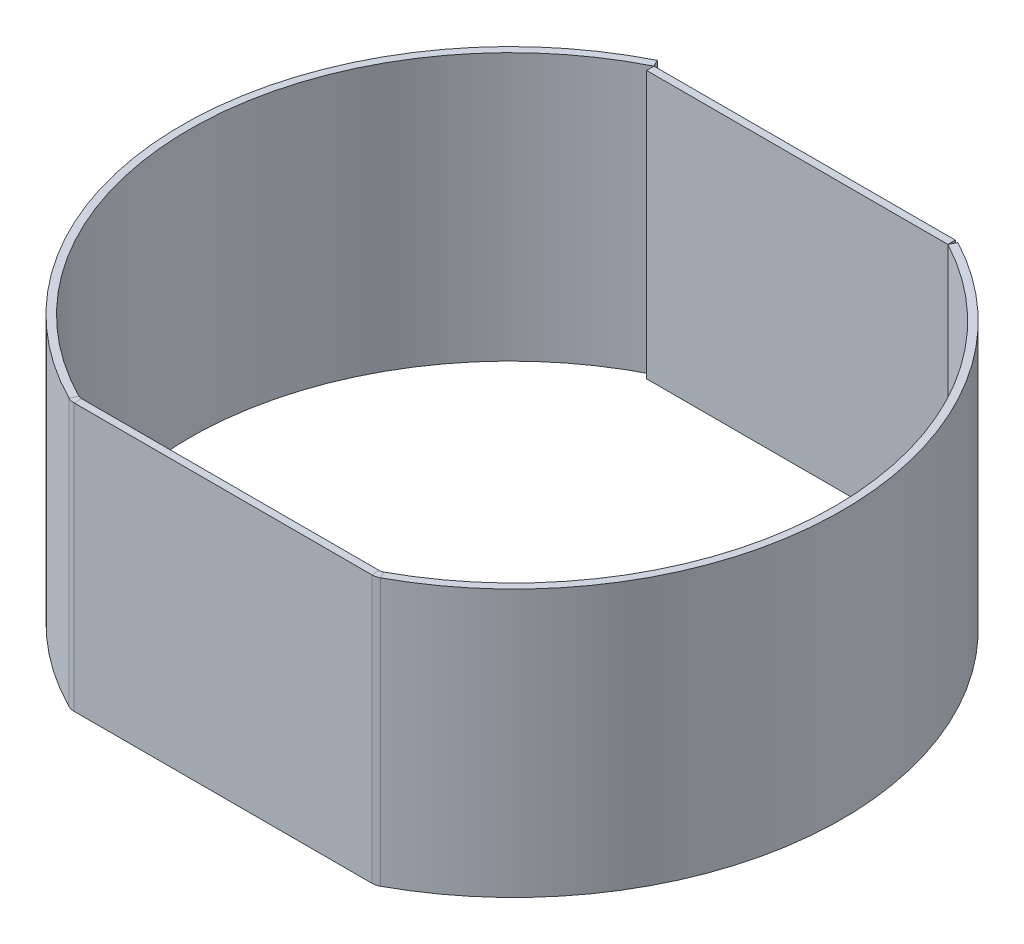
ISO-10303-21;
HEADER;
FILE_DESCRIPTION(('STEP AP214'),'2;1');
FILE_NAME('part.step','',(''),(''),'','','');
FILE_SCHEMA(('AUTOMOTIVE_DESIGN { 1 0 10303 214 1 1 1 1 }'));
ENDSEC;
DATA;
#1=APPLICATION_CONTEXT('core data for automotive mechanical design processes');
#2=APPLICATION_PROTOCOL_DEFINITION('international standard','automotive_design',2000,#1);
#3=PRODUCT_CONTEXT('',#1,'mechanical');
#4=PRODUCT('Part','Part','',(#3));
#5=PRODUCT_RELATED_PRODUCT_CATEGORY('part','',(#4));
#6=PRODUCT_DEFINITION_FORMATION('','',#4);
#7=PRODUCT_DEFINITION_CONTEXT('part definition',#1,'design');
#8=PRODUCT_DEFINITION('design','',#6,#7);
#9=PRODUCT_DEFINITION_SHAPE('','',#8);
#10=(LENGTH_UNIT() NAMED_UNIT(*) SI_UNIT(.MILLI.,.METRE.));
#11=(NAMED_UNIT(*) PLANE_ANGLE_UNIT() SI_UNIT($,.RADIAN.));
#12=(NAMED_UNIT(*) SI_UNIT($,.STERADIAN.) SOLID_ANGLE_UNIT());
#13=UNCERTAINTY_MEASURE_WITH_UNIT(LENGTH_MEASURE(1.E-05),#10,'distance_accuracy_value','');
#14=(GEOMETRIC_REPRESENTATION_CONTEXT(3) GLOBAL_UNCERTAINTY_ASSIGNED_CONTEXT((#13)) GLOBAL_UNIT_ASSIGNED_CONTEXT((#10,
#11,#12)) REPRESENTATION_CONTEXT('',''));
#15=CARTESIAN_POINT('',(0.,0.,0.));
#16=DIRECTION('',(0.,0.,1.));
#17=DIRECTION('',(1.,0.,0.));
#18=AXIS2_PLACEMENT_3D('',#15,#16,#17);
#19=CARTESIAN_POINT('',(-15.0637686543508,0.,55.987651013147));
#20=DIRECTION('',(0.,-1.,0.));
#21=DIRECTION('',(0.,0.,-1.));
#22=AXIS2_PLACEMENT_3D('',#19,#20,#21);
#23=PLANE('',#22);
#24=DIRECTION('',(-0.45195055435013,0.,0.892042990232315));
#25=VECTOR('',#24,1.);
#26=CARTESIAN_POINT('',(-15.0637686543508,0.,55.987651013147));
#27=LINE('',#26,#25);
#28=CARTESIAN_POINT('',(-15.0637686543508,0.,55.987651013147));
#29=VERTEX_POINT('',#28);
#30=CARTESIAN_POINT('',(-15.3966754326851,0.,56.6447298797522));
#31=VERTEX_POINT('',#30);
#32=EDGE_CURVE('E12',#29,#31,#27,.T.);
#33=ORIENTED_EDGE('',*,*,#32,.F.);
#34=CARTESIAN_POINT('',(-14.7308618760165,0.,55.3305721465419));
#35=DIRECTION('',(0.,-1.,0.));
#36=DIRECTION('',(0.,0.,-1.));
#37=AXIS2_PLACEMENT_3D('',#34,#35,#36);
#38=CIRCLE('',#37,0.7366);
#39=CARTESIAN_POINT('',(-14.7308618760165,0.,56.0671721465419));
#40=VERTEX_POINT('',#39);
#41=EDGE_CURVE('E202',#40,#29,#38,.T.);
#42=ORIENTED_EDGE('',*,*,#41,.F.);
#43=DIRECTION('',(0.,0.,-1.));
#44=VECTOR('',#43,1.);
#45=CARTESIAN_POINT('',(-14.7308618760165,0.,56.8037721465419));
#46=LINE('',#45,#44);
#47=CARTESIAN_POINT('',(-14.7308618760165,0.,56.8037721465419));
#48=VERTEX_POINT('',#47);
#49=EDGE_CURVE('E53',#48,#40,#46,.T.);
#50=ORIENTED_EDGE('',*,*,#49,.F.);
#51=CARTESIAN_POINT('',(-14.7308618760165,0.,55.3305721465419));
#52=DIRECTION('',(0.,-1.,0.));
#53=DIRECTION('',(1.,0.,0.));
#54=AXIS2_PLACEMENT_3D('',#51,#52,#53);
#55=CIRCLE('',#54,1.4732);
#56=EDGE_CURVE('E178',#48,#31,#55,.T.);
#57=ORIENTED_EDGE('',*,*,#56,.T.);
#58=EDGE_LOOP('',(#33,#42,#50,#57));
#59=FACE_BOUND('',#58,.T.);
#60=ADVANCED_FACE('F46',(#59),#23,.T.);
#61=CARTESIAN_POINT('',(-14.7308618760165,0.,56.8037721465419));
#62=DIRECTION('',(0.,-1.,0.));
#63=DIRECTION('',(0.,0.,-1.));
#64=AXIS2_PLACEMENT_3D('',#61,#62,#63);
#65=PLANE('',#64);
#66=CARTESIAN_POINT('',(-0.714338553734361,0.,27.665286073271));
#67=DIRECTION('',(0.,-1.,0.));
#68=DIRECTION('',(0.,0.,-1.));
#69=AXIS2_PLACEMENT_3D('',#66,#67,#68);
#70=CIRCLE('',#69,31.75);
#71=CARTESIAN_POINT('',(-14.905722118452,0.,-0.736599999999993));
#72=VERTEX_POINT('',#71);
#73=EDGE_CURVE('E212',#29,#72,#70,.T.);
#74=ORIENTED_EDGE('',*,*,#73,.F.);
#75=ORIENTED_EDGE('',*,*,#32,.T.);
#76=CARTESIAN_POINT('',(-0.714338553734361,0.,27.665286073271));
#77=DIRECTION('',(0.,-1.,0.));
#78=DIRECTION('',(1.,0.,0.));
#79=AXIS2_PLACEMENT_3D('',#76,#77,#78);
#80=CIRCLE('',#79,32.4866);
#81=CARTESIAN_POINT('',(-15.2349622171535,0.,-1.39552375689986));
#82=VERTEX_POINT('',#81);
#83=EDGE_CURVE('E285',#31,#82,#80,.T.);
#84=ORIENTED_EDGE('',*,*,#83,.T.);
#85=DIRECTION('',(-0.446972710699801,0.,-0.894547592858911));
#86=VECTOR('',#85,1.);
#87=CARTESIAN_POINT('',(-14.905722118452,0.,-0.736599999999993));
#88=LINE('',#87,#86);
#89=EDGE_CURVE('E215',#72,#82,#88,.T.);
#90=ORIENTED_EDGE('',*,*,#89,.F.);
#91=EDGE_LOOP('',(#74,#75,#84,#90));
#92=FACE_BOUND('',#91,.T.);
#93=ADVANCED_FACE('F294',(#92),#65,.T.);
#94=CARTESIAN_POINT('',(14.7209215362236,0.,56.0671721465419));
#95=DIRECTION('',(0.,-1.,0.));
#96=DIRECTION('',(0.,0.,-1.));
#97=AXIS2_PLACEMENT_3D('',#94,#95,#96);
#98=PLANE('',#97);
#99=DIRECTION('',(0.,0.,1.));
#100=VECTOR('',#99,1.);
#101=CARTESIAN_POINT('',(14.7209215362236,0.,56.0671721465419));
#102=LINE('',#101,#100);
#103=CARTESIAN_POINT('',(14.7209215362236,0.,56.0671721465419));
#104=VERTEX_POINT('',#103);
#105=CARTESIAN_POINT('',(14.7209215362236,0.,56.8037721465419));
#106=VERTEX_POINT('',#105);
#107=EDGE_CURVE('E181',#104,#106,#102,.T.);
#108=ORIENTED_EDGE('',*,*,#107,.F.);
#109=CARTESIAN_POINT('',(14.7209215362236,0.,55.3305721465419));
#110=DIRECTION('',(0.,-1.,0.));
#111=DIRECTION('',(0.,0.,-1.));
#112=AXIS2_PLACEMENT_3D('',#109,#110,#111);
#113=CIRCLE('',#112,0.7366);
#114=CARTESIAN_POINT('',(15.0705584932674,0.,55.9789035110995));
#115=VERTEX_POINT('',#114);
#116=EDGE_CURVE('E210',#115,#104,#113,.T.);
#117=ORIENTED_EDGE('',*,*,#116,.F.);
#118=DIRECTION('',(-0.47466325963047,0.,-0.880167478356805));
#119=VECTOR('',#118,1.);
#120=CARTESIAN_POINT('',(15.4201954503112,0.,56.6272348756572));
#121=LINE('',#120,#119);
#122=CARTESIAN_POINT('',(15.4201954503112,0.,56.6272348756572));
#123=VERTEX_POINT('',#122);
#124=EDGE_CURVE('E179',#123,#115,#121,.T.);
#125=ORIENTED_EDGE('',*,*,#124,.F.);
#126=CARTESIAN_POINT('',(14.7209215362236,0.,55.3305721465419));
#127=DIRECTION('',(0.,-1.,0.));
#128=DIRECTION('',(1.,0.,0.));
#129=AXIS2_PLACEMENT_3D('',#126,#127,#128);
#130=CIRCLE('',#129,1.4732);
#131=EDGE_CURVE('E226',#123,#106,#130,.T.);
#132=ORIENTED_EDGE('',*,*,#131,.T.);
#133=EDGE_LOOP('',(#108,#117,#125,#132));
#134=FACE_BOUND('',#133,.T.);
#135=ADVANCED_FACE('F250',(#134),#98,.T.);
#136=CARTESIAN_POINT('',(15.4201954503112,0.,56.6272348756572));
#137=DIRECTION('',(0.,-1.,0.));
#138=DIRECTION('',(0.,0.,-1.));
#139=AXIS2_PLACEMENT_3D('',#136,#137,#138);
#140=PLANE('',#139);
#141=DIRECTION('',(-1.,0.,0.));
#142=VECTOR('',#141,1.);
#143=CARTESIAN_POINT('',(14.905722118452,0.,56.0671721465419));
#144=LINE('',#143,#142);
#145=EDGE_CURVE('E188',#104,#40,#144,.T.);
#146=ORIENTED_EDGE('',*,*,#145,.F.);
#147=ORIENTED_EDGE('',*,*,#107,.T.);
#148=DIRECTION('',(1.,0.,0.));
#149=VECTOR('',#148,1.);
#150=CARTESIAN_POINT('',(14.905722118452,0.,56.8037721465419));
#151=LINE('',#150,#149);
#152=EDGE_CURVE('E190',#106,#48,#151,.F.);
#153=ORIENTED_EDGE('',*,*,#152,.T.);
#154=ORIENTED_EDGE('',*,*,#49,.T.);
#155=EDGE_LOOP('',(#146,#147,#153,#154));
#156=FACE_BOUND('',#155,.T.);
#157=ADVANCED_FACE('F186',(#156),#140,.T.);
#158=CARTESIAN_POINT('',(-0.714338553734361,114.186100522411,27.665286073271));
#159=DIRECTION('',(0.,-1.,0.));
#160=DIRECTION('',(0.,0.,-1.));
#161=AXIS2_PLACEMENT_3D('',#158,#159,#160);
#162=CYLINDRICAL_SURFACE('',#161,32.4866);
#163=DIRECTION('',(0.,-1.,0.));
#164=VECTOR('',#163,1.);
#165=CARTESIAN_POINT('',(-15.3966754326851,114.186100522411,56.6447298797522));
#166=LINE('',#165,#164);
#167=CARTESIAN_POINT('',(-15.3966754326851,26.425,56.6447298797522));
#168=VERTEX_POINT('',#167);
#169=EDGE_CURVE('E182',#168,#31,#166,.T.);
#170=ORIENTED_EDGE('',*,*,#169,.F.);
#171=CARTESIAN_POINT('',(-0.714338553734361,26.425,27.665286073271));
#172=DIRECTION('',(0.,1.,0.));
#173=DIRECTION('',(0.,0.,1.));
#174=AXIS2_PLACEMENT_3D('',#171,#172,#173);
#175=CIRCLE('',#174,32.4866);
#176=CARTESIAN_POINT('',(-15.2349622171535,26.425,-1.39552375689986));
#177=VERTEX_POINT('',#176);
#178=EDGE_CURVE('E267',#168,#177,#175,.F.);
#179=ORIENTED_EDGE('',*,*,#178,.T.);
#180=DIRECTION('',(0.,-1.,0.));
#181=VECTOR('',#180,1.);
#182=CARTESIAN_POINT('',(-15.2349622171535,114.186100522411,-1.39552375689986));
#183=LINE('',#182,#181);
#184=EDGE_CURVE('E176',#177,#82,#183,.T.);
#185=ORIENTED_EDGE('',*,*,#184,.T.);
#186=ORIENTED_EDGE('',*,*,#83,.F.);
#187=EDGE_LOOP('',(#170,#179,#185,#186));
#188=FACE_BOUND('',#187,.T.);
#189=ADVANCED_FACE('F297',(#188),#162,.T.);
#190=CARTESIAN_POINT('',(-14.7308618760165,114.186100522411,55.3305721465419));
#191=DIRECTION('',(0.,-1.,0.));
#192=DIRECTION('',(0.,0.,-1.));
#193=AXIS2_PLACEMENT_3D('',#190,#191,#192);
#194=CYLINDRICAL_SURFACE('',#193,1.4732);
#195=DIRECTION('',(0.,-1.,0.));
#196=VECTOR('',#195,1.);
#197=CARTESIAN_POINT('',(-14.7308618760165,114.186100522411,56.8037721465419));
#198=LINE('',#197,#196);
#199=CARTESIAN_POINT('',(-14.7308618760165,26.425,56.8037721465419));
#200=VERTEX_POINT('',#199);
#201=EDGE_CURVE('E232',#200,#48,#198,.T.);
#202=ORIENTED_EDGE('',*,*,#201,.F.);
#203=CARTESIAN_POINT('',(-14.7308618760165,26.425,55.3305721465419));
#204=DIRECTION('',(0.,-1.,0.));
#205=DIRECTION('',(0.,0.,-1.));
#206=AXIS2_PLACEMENT_3D('',#203,#204,#205);
#207=CIRCLE('',#206,1.4732);
#208=EDGE_CURVE('E265',#168,#200,#207,.F.);
#209=ORIENTED_EDGE('',*,*,#208,.F.);
#210=ORIENTED_EDGE('',*,*,#169,.T.);
#211=ORIENTED_EDGE('',*,*,#56,.F.);
#212=EDGE_LOOP('',(#202,#209,#210,#211));
#213=FACE_BOUND('',#212,.T.);
#214=ADVANCED_FACE('F300',(#213),#194,.T.);
#215=CARTESIAN_POINT('',(14.905722118452,114.186100522411,56.8037721465419));
#216=DIRECTION('',(0.,0.,1.));
#217=DIRECTION('',(1.,0.,0.));
#218=AXIS2_PLACEMENT_3D('',#215,#216,#217);
#219=PLANE('',#218);
#220=DIRECTION('',(0.,-1.,0.));
#221=VECTOR('',#220,1.);
#222=CARTESIAN_POINT('',(14.7209215362236,114.186100522411,56.8037721465419));
#223=LINE('',#222,#221);
#224=CARTESIAN_POINT('',(14.7209215362236,26.425,56.8037721465419));
#225=VERTEX_POINT('',#224);
#226=EDGE_CURVE('E234',#225,#106,#223,.T.);
#227=ORIENTED_EDGE('',*,*,#226,.F.);
#228=DIRECTION('',(1.,0.,0.));
#229=VECTOR('',#228,1.);
#230=CARTESIAN_POINT('',(14.905722118452,26.425,56.8037721465419));
#231=LINE('',#230,#229);
#232=EDGE_CURVE('E276',#225,#200,#231,.F.);
#233=ORIENTED_EDGE('',*,*,#232,.T.);
#234=ORIENTED_EDGE('',*,*,#201,.T.);
#235=ORIENTED_EDGE('',*,*,#152,.F.);
#236=EDGE_LOOP('',(#227,#233,#234,#235));
#237=FACE_BOUND('',#236,.T.);
#238=ADVANCED_FACE('F308',(#237),#219,.T.);
#239=CARTESIAN_POINT('',(14.7209215362236,114.186100522411,55.3305721465419));
#240=DIRECTION('',(0.,-1.,0.));
#241=DIRECTION('',(0.,0.,-1.));
#242=AXIS2_PLACEMENT_3D('',#239,#240,#241);
#243=CYLINDRICAL_SURFACE('',#242,1.4732);
#244=DIRECTION('',(0.,-1.,0.));
#245=VECTOR('',#244,1.);
#246=CARTESIAN_POINT('',(15.4201954503112,114.186100522411,56.6272348756572));
#247=LINE('',#246,#245);
#248=CARTESIAN_POINT('',(15.4201954503112,26.425,56.6272348756572));
#249=VERTEX_POINT('',#248);
#250=EDGE_CURVE('E160',#249,#123,#247,.T.);
#251=ORIENTED_EDGE('',*,*,#250,.F.);
#252=CARTESIAN_POINT('',(14.7209215362236,26.425,55.3305721465419));
#253=DIRECTION('',(0.,-1.,0.));
#254=DIRECTION('',(0.,0.,-1.));
#255=AXIS2_PLACEMENT_3D('',#252,#253,#254);
#256=CIRCLE('',#255,1.4732);
#257=EDGE_CURVE('E259',#225,#249,#256,.F.);
#258=ORIENTED_EDGE('',*,*,#257,.F.);
#259=ORIENTED_EDGE('',*,*,#226,.T.);
#260=ORIENTED_EDGE('',*,*,#131,.F.);
#261=EDGE_LOOP('',(#251,#258,#259,#260));
#262=FACE_BOUND('',#261,.T.);
#263=ADVANCED_FACE('F244',(#262),#243,.T.);
#264=CARTESIAN_POINT('',(0.,114.186100522411,28.033586073271));
#265=DIRECTION('',(0.,-1.,0.));
#266=DIRECTION('',(0.,0.,-1.));
#267=AXIS2_PLACEMENT_3D('',#264,#265,#266);
#268=CYLINDRICAL_SURFACE('',#267,32.4866);
#269=DIRECTION('',(0.,-1.,0.));
#270=VECTOR('',#269,1.);
#271=CARTESIAN_POINT('',(15.2515348716001,114.186100522411,-0.650379196899888));
#272=LINE('',#271,#270);
#273=CARTESIAN_POINT('',(15.2515348716001,26.425,-0.650379196899888));
#274=VERTEX_POINT('',#273);
#275=CARTESIAN_POINT('',(15.2515348716001,0.,-0.650379196899888));
#276=VERTEX_POINT('',#275);
#277=EDGE_CURVE('E158',#274,#276,#272,.T.);
#278=ORIENTED_EDGE('',*,*,#277,.F.);
#279=CARTESIAN_POINT('',(0.,26.425,28.033586073271));
#280=DIRECTION('',(0.,-1.,0.));
#281=DIRECTION('',(0.,0.,-1.));
#282=AXIS2_PLACEMENT_3D('',#279,#280,#281);
#283=CIRCLE('',#282,32.4866);
#284=EDGE_CURVE('E140',#249,#274,#283,.F.);
#285=ORIENTED_EDGE('',*,*,#284,.F.);
#286=ORIENTED_EDGE('',*,*,#250,.T.);
#287=CARTESIAN_POINT('',(0.,0.,28.033586073271));
#288=DIRECTION('',(0.,-1.,0.));
#289=DIRECTION('',(1.,0.,0.));
#290=AXIS2_PLACEMENT_3D('',#287,#288,#289);
#291=CIRCLE('',#290,32.4866);
#292=EDGE_CURVE('E223',#276,#123,#291,.T.);
#293=ORIENTED_EDGE('',*,*,#292,.F.);
#294=EDGE_LOOP('',(#278,#285,#286,#293));
#295=FACE_BOUND('',#294,.T.);
#296=ADVANCED_FACE('F241',(#295),#268,.T.);
#297=CARTESIAN_POINT('',(15.2515348716001,114.186100522411,-0.650379196899888));
#298=DIRECTION('',(0.88294759285893,0.,0.469471562785885));
#299=DIRECTION('',(0.469471562785885,0.,-0.88294759285893));
#300=AXIS2_PLACEMENT_3D('',#297,#298,#299);
#301=PLANE('',#300);
#302=DIRECTION('',(-0.469471562785889,0.,0.882947592858928));
#303=VECTOR('',#302,1.);
#304=CARTESIAN_POINT('',(14.905722118452,26.425,0.));
#305=LINE('',#304,#303);
#306=CARTESIAN_POINT('',(14.905722118452,26.425,0.));
#307=VERTEX_POINT('',#306);
#308=EDGE_CURVE('E133',#307,#274,#305,.F.);
#309=ORIENTED_EDGE('',*,*,#308,.T.);
#310=ORIENTED_EDGE('',*,*,#277,.T.);
#311=DIRECTION('',(-0.469471562785885,0.,0.88294759285893));
#312=VECTOR('',#311,1.);
#313=CARTESIAN_POINT('',(15.2515348716001,0.,-0.650379196899888));
#314=LINE('',#313,#312);
#315=CARTESIAN_POINT('',(14.905722118452,0.,0.));
#316=VERTEX_POINT('',#315);
#317=EDGE_CURVE('E156',#276,#316,#314,.T.);
#318=ORIENTED_EDGE('',*,*,#317,.T.);
#319=DIRECTION('',(0.,-1.,0.));
#320=VECTOR('',#319,1.);
#321=CARTESIAN_POINT('',(14.905722118452,114.186100522411,0.));
#322=LINE('',#321,#320);
#323=EDGE_CURVE('E149',#307,#316,#322,.T.);
#324=ORIENTED_EDGE('',*,*,#323,.F.);
#325=EDGE_LOOP('',(#309,#310,#318,#324));
#326=FACE_BOUND('',#325,.T.);
#327=ADVANCED_FACE('F154',(#326),#301,.F.);
#328=CARTESIAN_POINT('',(0.,114.186100522411,28.033586073271));
#329=DIRECTION('',(0.,-1.,0.));
#330=DIRECTION('',(0.,0.,-1.));
#331=AXIS2_PLACEMENT_3D('',#328,#329,#330);
#332=CYLINDRICAL_SURFACE('',#331,31.75);
#333=CARTESIAN_POINT('',(0.,26.425,28.033586073271));
#334=DIRECTION('',(0.,1.,0.));
#335=DIRECTION('',(0.,0.,1.));
#336=AXIS2_PLACEMENT_3D('',#333,#334,#335);
#337=CIRCLE('',#336,31.75);
#338=CARTESIAN_POINT('',(15.0705584932674,26.425,55.9789035110995));
#339=VERTEX_POINT('',#338);
#340=EDGE_CURVE('E137',#307,#339,#337,.F.);
#341=ORIENTED_EDGE('',*,*,#340,.F.);
#342=ORIENTED_EDGE('',*,*,#323,.T.);
#343=CARTESIAN_POINT('',(0.,0.,28.033586073271));
#344=DIRECTION('',(0.,-1.,0.));
#345=DIRECTION('',(0.,0.,-1.));
#346=AXIS2_PLACEMENT_3D('',#343,#344,#345);
#347=CIRCLE('',#346,31.75);
#348=EDGE_CURVE('E220',#316,#115,#347,.T.);
#349=ORIENTED_EDGE('',*,*,#348,.T.);
#350=DIRECTION('',(0.,-1.,0.));
#351=VECTOR('',#350,1.);
#352=CARTESIAN_POINT('',(15.0705584932674,114.186100522411,55.9789035110995));
#353=LINE('',#352,#351);
#354=EDGE_CURVE('E152',#339,#115,#353,.T.);
#355=ORIENTED_EDGE('',*,*,#354,.F.);
#356=EDGE_LOOP('',(#341,#342,#349,#355));
#357=FACE_BOUND('',#356,.T.);
#358=ADVANCED_FACE('F147',(#357),#332,.F.);
#359=CARTESIAN_POINT('',(14.7209215362236,114.186100522411,55.3305721465419));
#360=DIRECTION('',(0.,-1.,0.));
#361=DIRECTION('',(0.,0.,-1.));
#362=AXIS2_PLACEMENT_3D('',#359,#360,#361);
#363=CYLINDRICAL_SURFACE('',#362,0.7366);
#364=CARTESIAN_POINT('',(14.7209215362236,26.425,55.3305721465419));
#365=DIRECTION('',(0.,1.,0.));
#366=DIRECTION('',(0.,0.,1.));
#367=AXIS2_PLACEMENT_3D('',#364,#365,#366);
#368=CIRCLE('',#367,0.7366);
#369=CARTESIAN_POINT('',(14.7209215362236,26.425,56.0671721465419));
#370=VERTEX_POINT('',#369);
#371=EDGE_CURVE('E253',#339,#370,#368,.F.);
#372=ORIENTED_EDGE('',*,*,#371,.F.);
#373=ORIENTED_EDGE('',*,*,#354,.T.);
#374=ORIENTED_EDGE('',*,*,#116,.T.);
#375=DIRECTION('',(0.,-1.,0.));
#376=VECTOR('',#375,1.);
#377=CARTESIAN_POINT('',(14.7209215362236,114.186100522411,56.0671721465419));
#378=LINE('',#377,#376);
#379=EDGE_CURVE('E162',#370,#104,#378,.T.);
#380=ORIENTED_EDGE('',*,*,#379,.F.);
#381=EDGE_LOOP('',(#372,#373,#374,#380));
#382=FACE_BOUND('',#381,.T.);
#383=ADVANCED_FACE('F252',(#382),#363,.F.);
#384=CARTESIAN_POINT('',(14.905722118452,114.186100522411,56.0671721465419));
#385=DIRECTION('',(0.,0.,1.));
#386=DIRECTION('',(1.,0.,0.));
#387=AXIS2_PLACEMENT_3D('',#384,#385,#386);
#388=PLANE('',#387);
#389=DIRECTION('',(-1.,0.,0.));
#390=VECTOR('',#389,1.);
#391=CARTESIAN_POINT('',(14.905722118452,26.425,56.0671721465419));
#392=LINE('',#391,#390);
#393=CARTESIAN_POINT('',(-14.7308618760165,26.425,56.0671721465419));
#394=VERTEX_POINT('',#393);
#395=EDGE_CURVE('E275',#370,#394,#392,.T.);
#396=ORIENTED_EDGE('',*,*,#395,.F.);
#397=ORIENTED_EDGE('',*,*,#379,.T.);
#398=ORIENTED_EDGE('',*,*,#145,.T.);
#399=DIRECTION('',(0.,-1.,0.));
#400=VECTOR('',#399,1.);
#401=CARTESIAN_POINT('',(-14.7308618760165,114.186100522411,56.0671721465419));
#402=LINE('',#401,#400);
#403=EDGE_CURVE('E168',#394,#40,#402,.T.);
#404=ORIENTED_EDGE('',*,*,#403,.F.);
#405=EDGE_LOOP('',(#396,#397,#398,#404));
#406=FACE_BOUND('',#405,.T.);
#407=ADVANCED_FACE('F207',(#406),#388,.F.);
#408=CARTESIAN_POINT('',(-14.7308618760165,114.186100522411,55.3305721465419));
#409=DIRECTION('',(0.,-1.,0.));
#410=DIRECTION('',(0.,0.,-1.));
#411=AXIS2_PLACEMENT_3D('',#408,#409,#410);
#412=CYLINDRICAL_SURFACE('',#411,0.7366);
#413=CARTESIAN_POINT('',(-14.7308618760165,26.425,55.3305721465419));
#414=DIRECTION('',(0.,1.,0.));
#415=DIRECTION('',(0.,0.,1.));
#416=AXIS2_PLACEMENT_3D('',#413,#414,#415);
#417=CIRCLE('',#416,0.7366);
#418=CARTESIAN_POINT('',(-15.0637686543508,26.425,55.987651013147));
#419=VERTEX_POINT('',#418);
#420=EDGE_CURVE('E204',#394,#419,#417,.F.);
#421=ORIENTED_EDGE('',*,*,#420,.F.);
#422=ORIENTED_EDGE('',*,*,#403,.T.);
#423=ORIENTED_EDGE('',*,*,#41,.T.);
#424=DIRECTION('',(0.,-1.,0.));
#425=VECTOR('',#424,1.);
#426=CARTESIAN_POINT('',(-15.0637686543508,114.186100522411,55.987651013147));
#427=LINE('',#426,#425);
#428=EDGE_CURVE('E171',#419,#29,#427,.T.);
#429=ORIENTED_EDGE('',*,*,#428,.F.);
#430=EDGE_LOOP('',(#421,#422,#423,#429));
#431=FACE_BOUND('',#430,.T.);
#432=ADVANCED_FACE('F200',(#431),#412,.F.);
#433=CARTESIAN_POINT('',(-0.714338553734361,114.186100522411,27.665286073271));
#434=DIRECTION('',(0.,-1.,0.));
#435=DIRECTION('',(0.,0.,-1.));
#436=AXIS2_PLACEMENT_3D('',#433,#434,#435);
#437=CYLINDRICAL_SURFACE('',#436,31.75);
#438=CARTESIAN_POINT('',(-0.714338553734361,26.425,27.665286073271));
#439=DIRECTION('',(0.,-1.,0.));
#440=DIRECTION('',(0.,0.,-1.));
#441=AXIS2_PLACEMENT_3D('',#438,#439,#440);
#442=CIRCLE('',#441,31.75);
#443=CARTESIAN_POINT('',(-14.905722118452,26.425,-0.736599999999993));
#444=VERTEX_POINT('',#443);
#445=EDGE_CURVE('E60',#444,#419,#442,.F.);
#446=ORIENTED_EDGE('',*,*,#445,.T.);
#447=ORIENTED_EDGE('',*,*,#428,.T.);
#448=ORIENTED_EDGE('',*,*,#73,.T.);
#449=DIRECTION('',(0.,-1.,0.));
#450=VECTOR('',#449,1.);
#451=CARTESIAN_POINT('',(-14.905722118452,114.186100522411,-0.736599999999993));
#452=LINE('',#451,#450);
#453=EDGE_CURVE('E174',#444,#72,#452,.T.);
#454=ORIENTED_EDGE('',*,*,#453,.F.);
#455=EDGE_LOOP('',(#446,#447,#448,#454));
#456=FACE_BOUND('',#455,.T.);
#457=ADVANCED_FACE('F332',(#456),#437,.F.);
#458=CARTESIAN_POINT('',(-14.905722118452,114.186100522411,-0.736599999999993));
#459=DIRECTION('',(-0.894547592858911,0.,0.446972710699801));
#460=DIRECTION('',(0.446972710699801,0.,0.894547592858911));
#461=AXIS2_PLACEMENT_3D('',#458,#459,#460);
#462=PLANE('',#461);
#463=DIRECTION('',(-0.446972710699769,0.,-0.894547592858927));
#464=VECTOR('',#463,1.);
#465=CARTESIAN_POINT('',(-15.2349622171535,26.425,-1.39552375689986));
#466=LINE('',#465,#464);
#467=EDGE_CURVE('E271',#177,#444,#466,.F.);
#468=ORIENTED_EDGE('',*,*,#467,.T.);
#469=ORIENTED_EDGE('',*,*,#453,.T.);
#470=ORIENTED_EDGE('',*,*,#89,.T.);
#471=ORIENTED_EDGE('',*,*,#184,.F.);
#472=EDGE_LOOP('',(#468,#469,#470,#471));
#473=FACE_BOUND('',#472,.T.);
#474=ADVANCED_FACE('F291',(#473),#462,.F.);
#475=CARTESIAN_POINT('',(-0.714338553734361,0.,27.665286073271));
#476=DIRECTION('',(0.,-1.,0.));
#477=DIRECTION('',(1.,0.,0.));
#478=AXIS2_PLACEMENT_3D('',#475,#476,#477);
#479=PLANE('',#478);
#480=ORIENTED_EDGE('',*,*,#292,.T.);
#481=ORIENTED_EDGE('',*,*,#124,.T.);
#482=ORIENTED_EDGE('',*,*,#348,.F.);
#483=ORIENTED_EDGE('',*,*,#317,.F.);
#484=EDGE_LOOP('',(#480,#481,#482,#483));
#485=FACE_BOUND('',#484,.T.);
#486=ADVANCED_FACE('F248',(#485),#479,.T.);
#487=CARTESIAN_POINT('',(14.905722118452,26.425,56.0671721465419));
#488=DIRECTION('',(0.,1.,0.));
#489=DIRECTION('',(-1.,0.,0.));
#490=AXIS2_PLACEMENT_3D('',#487,#488,#489);
#491=PLANE('',#490);
#492=ORIENTED_EDGE('',*,*,#395,.T.);
#493=DIRECTION('',(0.,0.,-1.));
#494=VECTOR('',#493,1.);
#495=CARTESIAN_POINT('',(-14.7308618760165,26.425,56.0671721465419));
#496=LINE('',#495,#494);
#497=EDGE_CURVE('E282',#394,#200,#496,.F.);
#498=ORIENTED_EDGE('',*,*,#497,.T.);
#499=ORIENTED_EDGE('',*,*,#232,.F.);
#500=DIRECTION('',(0.,0.,-1.));
#501=VECTOR('',#500,1.);
#502=CARTESIAN_POINT('',(14.7209215362236,26.425,56.0671721465419));
#503=LINE('',#502,#501);
#504=EDGE_CURVE('E279',#370,#225,#503,.F.);
#505=ORIENTED_EDGE('',*,*,#504,.F.);
#506=EDGE_LOOP('',(#492,#498,#499,#505));
#507=FACE_BOUND('',#506,.T.);
#508=ADVANCED_FACE('F306',(#507),#491,.T.);
#509=CARTESIAN_POINT('',(-0.714338553734361,26.425,27.665286073271));
#510=DIRECTION('',(0.,-1.,0.));
#511=DIRECTION('',(0.,0.,-1.));
#512=AXIS2_PLACEMENT_3D('',#509,#510,#511);
#513=PLANE('',#512);
#514=ORIENTED_EDGE('',*,*,#467,.F.);
#515=ORIENTED_EDGE('',*,*,#178,.F.);
#516=DIRECTION('',(-0.451950554350125,0.,0.892042990232317));
#517=VECTOR('',#516,1.);
#518=CARTESIAN_POINT('',(-15.3966754326851,26.425,56.6447298797522));
#519=LINE('',#518,#517);
#520=EDGE_CURVE('E270',#168,#419,#519,.F.);
#521=ORIENTED_EDGE('',*,*,#520,.T.);
#522=ORIENTED_EDGE('',*,*,#445,.F.);
#523=EDGE_LOOP('',(#514,#515,#521,#522));
#524=FACE_BOUND('',#523,.T.);
#525=ADVANCED_FACE('F391',(#524),#513,.F.);
#526=CARTESIAN_POINT('',(-14.7308618760165,26.425,55.3305721465419));
#527=DIRECTION('',(0.,-1.,0.));
#528=DIRECTION('',(0.,0.,-1.));
#529=AXIS2_PLACEMENT_3D('',#526,#527,#528);
#530=PLANE('',#529);
#531=ORIENTED_EDGE('',*,*,#208,.T.);
#532=ORIENTED_EDGE('',*,*,#497,.F.);
#533=ORIENTED_EDGE('',*,*,#420,.T.);
#534=ORIENTED_EDGE('',*,*,#520,.F.);
#535=EDGE_LOOP('',(#531,#532,#533,#534));
#536=FACE_BOUND('',#535,.T.);
#537=ADVANCED_FACE('F304',(#536),#530,.F.);
#538=CARTESIAN_POINT('',(14.7209215362236,26.425,55.3305721465419));
#539=DIRECTION('',(0.,-1.,0.));
#540=DIRECTION('',(0.,0.,-1.));
#541=AXIS2_PLACEMENT_3D('',#538,#539,#540);
#542=PLANE('',#541);
#543=ORIENTED_EDGE('',*,*,#257,.T.);
#544=DIRECTION('',(-0.474663259630468,0.,-0.880167478356806));
#545=VECTOR('',#544,1.);
#546=CARTESIAN_POINT('',(15.0705584932674,26.425,55.9789035110995));
#547=LINE('',#546,#545);
#548=EDGE_CURVE('E257',#339,#249,#547,.F.);
#549=ORIENTED_EDGE('',*,*,#548,.F.);
#550=ORIENTED_EDGE('',*,*,#371,.T.);
#551=ORIENTED_EDGE('',*,*,#504,.T.);
#552=EDGE_LOOP('',(#543,#549,#550,#551));
#553=FACE_BOUND('',#552,.T.);
#554=ADVANCED_FACE('F404',(#553),#542,.F.);
#555=CARTESIAN_POINT('',(0.,26.425,28.033586073271));
#556=DIRECTION('',(0.,-1.,0.));
#557=DIRECTION('',(0.,0.,-1.));
#558=AXIS2_PLACEMENT_3D('',#555,#556,#557);
#559=PLANE('',#558);
#560=ORIENTED_EDGE('',*,*,#284,.T.);
#561=ORIENTED_EDGE('',*,*,#308,.F.);
#562=ORIENTED_EDGE('',*,*,#340,.T.);
#563=ORIENTED_EDGE('',*,*,#548,.T.);
#564=EDGE_LOOP('',(#560,#561,#562,#563));
#565=FACE_BOUND('',#564,.T.);
#566=ADVANCED_FACE('F135',(#565),#559,.F.);
#567=CLOSED_SHELL('',(#60,#93,#135,#157,#189,#214,#238,#263,#296,#327,#358,#383,#407,#432,#457,
#474,#486,#508,#525,#537,#554,#566));
#568=MANIFOLD_SOLID_BREP('B2',#567);
#569=CARTESIAN_POINT('',(14.905722118452,26.425,-0.7366));
#570=DIRECTION('',(1.,0.,0.));
#571=DIRECTION('',(0.,0.,-1.));
#572=AXIS2_PLACEMENT_3D('',#569,#570,#571);
#573=PLANE('',#572);
#574=DIRECTION('',(0.,1.,0.));
#575=VECTOR('',#574,1.);
#576=CARTESIAN_POINT('',(14.905722118452,26.425,0.));
#577=LINE('',#576,#575);
#578=CARTESIAN_POINT('',(14.905722118452,0.,0.));
#579=VERTEX_POINT('',#578);
#580=CARTESIAN_POINT('',(14.905722118452,26.425,0.));
#581=VERTEX_POINT('',#580);
#582=EDGE_CURVE('E597',#579,#581,#577,.T.);
#583=ORIENTED_EDGE('',*,*,#582,.F.);
#584=DIRECTION('',(0.,0.,1.));
#585=VECTOR('',#584,1.);
#586=CARTESIAN_POINT('',(14.905722118452,0.,-0.7366));
#587=LINE('',#586,#585);
#588=CARTESIAN_POINT('',(14.905722118452,0.,-0.7366));
#589=VERTEX_POINT('',#588);
#590=EDGE_CURVE('E44',#589,#579,#587,.T.);
#591=ORIENTED_EDGE('',*,*,#590,.F.);
#592=DIRECTION('',(0.,1.,0.));
#593=VECTOR('',#592,1.);
#594=CARTESIAN_POINT('',(14.905722118452,26.425,-0.7366));
#595=LINE('',#594,#593);
#596=CARTESIAN_POINT('',(14.905722118452,26.425,-0.7366));
#597=VERTEX_POINT('',#596);
#598=EDGE_CURVE('E591',#589,#597,#595,.T.);
#599=ORIENTED_EDGE('',*,*,#598,.T.);
#600=DIRECTION('',(0.,0.,1.));
#601=VECTOR('',#600,1.);
#602=CARTESIAN_POINT('',(14.905722118452,26.425,-0.7366));
#603=LINE('',#602,#601);
#604=EDGE_CURVE('E536',#597,#581,#603,.T.);
#605=ORIENTED_EDGE('',*,*,#604,.T.);
#606=EDGE_LOOP('',(#583,#591,#599,#605));
#607=FACE_BOUND('',#606,.T.);
#608=ADVANCED_FACE('F533',(#607),#573,.T.);
#609=CARTESIAN_POINT('',(-14.905722118452,0.,-0.7366));
#610=DIRECTION('',(0.,-1.,0.));
#611=DIRECTION('',(0.,0.,-1.));
#612=AXIS2_PLACEMENT_3D('',#609,#610,#611);
#613=PLANE('',#612);
#614=DIRECTION('',(1.,0.,0.));
#615=VECTOR('',#614,1.);
#616=CARTESIAN_POINT('',(-14.905722118452,0.,0.));
#617=LINE('',#616,#615);
#618=CARTESIAN_POINT('',(-14.905722118452,0.,0.));
#619=VERTEX_POINT('',#618);
#620=EDGE_CURVE('E593',#619,#579,#617,.T.);
#621=ORIENTED_EDGE('',*,*,#620,.F.);
#622=DIRECTION('',(0.,0.,1.));
#623=VECTOR('',#622,1.);
#624=CARTESIAN_POINT('',(-14.905722118452,0.,-0.7366));
#625=LINE('',#624,#623);
#626=CARTESIAN_POINT('',(-14.905722118452,0.,-0.7366));
#627=VERTEX_POINT('',#626);
#628=EDGE_CURVE('E542',#627,#619,#625,.T.);
#629=ORIENTED_EDGE('',*,*,#628,.F.);
#630=DIRECTION('',(1.,0.,0.));
#631=VECTOR('',#630,1.);
#632=CARTESIAN_POINT('',(-14.905722118452,0.,-0.7366));
#633=LINE('',#632,#631);
#634=EDGE_CURVE('E588',#627,#589,#633,.T.);
#635=ORIENTED_EDGE('',*,*,#634,.T.);
#636=ORIENTED_EDGE('',*,*,#590,.T.);
#637=EDGE_LOOP('',(#621,#629,#635,#636));
#638=FACE_BOUND('',#637,.T.);
#639=ADVANCED_FACE('F607',(#638),#613,.T.);
#640=CARTESIAN_POINT('',(-14.905722118452,26.425,-0.7366));
#641=DIRECTION('',(-1.,0.,0.));
#642=DIRECTION('',(0.,0.,1.));
#643=AXIS2_PLACEMENT_3D('',#640,#641,#642);
#644=PLANE('',#643);
#645=DIRECTION('',(0.,-1.,0.));
#646=VECTOR('',#645,1.);
#647=CARTESIAN_POINT('',(-14.905722118452,26.425,0.));
#648=LINE('',#647,#646);
#649=CARTESIAN_POINT('',(-14.905722118452,26.425,0.));
#650=VERTEX_POINT('',#649);
#651=EDGE_CURVE('E583',#650,#619,#648,.T.);
#652=ORIENTED_EDGE('',*,*,#651,.F.);
#653=DIRECTION('',(0.,0.,1.));
#654=VECTOR('',#653,1.);
#655=CARTESIAN_POINT('',(-14.905722118452,26.425,-0.7366));
#656=LINE('',#655,#654);
#657=CARTESIAN_POINT('',(-14.905722118452,26.425,-0.7366));
#658=VERTEX_POINT('',#657);
#659=EDGE_CURVE('E578',#658,#650,#656,.T.);
#660=ORIENTED_EDGE('',*,*,#659,.F.);
#661=DIRECTION('',(0.,-1.,0.));
#662=VECTOR('',#661,1.);
#663=CARTESIAN_POINT('',(-14.905722118452,26.425,-0.7366));
#664=LINE('',#663,#662);
#665=EDGE_CURVE('E581',#658,#627,#664,.T.);
#666=ORIENTED_EDGE('',*,*,#665,.T.);
#667=ORIENTED_EDGE('',*,*,#628,.T.);
#668=EDGE_LOOP('',(#652,#660,#666,#667));
#669=FACE_BOUND('',#668,.T.);
#670=ADVANCED_FACE('F580',(#669),#644,.T.);
#671=CARTESIAN_POINT('',(-14.905722118452,26.425,-0.7366));
#672=DIRECTION('',(0.,1.,0.));
#673=DIRECTION('',(0.,0.,1.));
#674=AXIS2_PLACEMENT_3D('',#671,#672,#673);
#675=PLANE('',#674);
#676=DIRECTION('',(-1.,0.,0.));
#677=VECTOR('',#676,1.);
#678=CARTESIAN_POINT('',(-14.905722118452,26.425,0.));
#679=LINE('',#678,#677);
#680=EDGE_CURVE('E600',#581,#650,#679,.T.);
#681=ORIENTED_EDGE('',*,*,#680,.F.);
#682=ORIENTED_EDGE('',*,*,#604,.F.);
#683=DIRECTION('',(-1.,0.,0.));
#684=VECTOR('',#683,1.);
#685=CARTESIAN_POINT('',(-14.905722118452,26.425,-0.7366));
#686=LINE('',#685,#684);
#687=EDGE_CURVE('E587',#597,#658,#686,.T.);
#688=ORIENTED_EDGE('',*,*,#687,.T.);
#689=ORIENTED_EDGE('',*,*,#659,.T.);
#690=EDGE_LOOP('',(#681,#682,#688,#689));
#691=FACE_BOUND('',#690,.T.);
#692=ADVANCED_FACE('F590',(#691),#675,.T.);
#693=CARTESIAN_POINT('',(0.,0.,-0.7366));
#694=DIRECTION('',(0.,0.,1.));
#695=DIRECTION('',(1.,0.,0.));
#696=AXIS2_PLACEMENT_3D('',#693,#694,#695);
#697=PLANE('',#696);
#698=ORIENTED_EDGE('',*,*,#598,.F.);
#699=ORIENTED_EDGE('',*,*,#634,.F.);
#700=ORIENTED_EDGE('',*,*,#665,.F.);
#701=ORIENTED_EDGE('',*,*,#687,.F.);
#702=EDGE_LOOP('',(#698,#699,#700,#701));
#703=FACE_BOUND('',#702,.T.);
#704=ADVANCED_FACE('F586',(#703),#697,.F.);
#705=CARTESIAN_POINT('',(0.,0.,0.));
#706=DIRECTION('',(0.,0.,1.));
#707=DIRECTION('',(1.,0.,0.));
#708=AXIS2_PLACEMENT_3D('',#705,#706,#707);
#709=PLANE('',#708);
#710=ORIENTED_EDGE('',*,*,#582,.T.);
#711=ORIENTED_EDGE('',*,*,#680,.T.);
#712=ORIENTED_EDGE('',*,*,#651,.T.);
#713=ORIENTED_EDGE('',*,*,#620,.T.);
#714=EDGE_LOOP('',(#710,#711,#712,#713));
#715=FACE_BOUND('',#714,.T.);
#716=ADVANCED_FACE('F606',(#715),#709,.T.);
#717=CLOSED_SHELL('',(#608,#639,#670,#692,#704,#716));
#718=MANIFOLD_SOLID_BREP('B6',#717);
#719=ADVANCED_BREP_SHAPE_REPRESENTATION('',(#18,#568,#718),#14);
#720=SHAPE_DEFINITION_REPRESENTATION(#9,#719);
ENDSEC;
END-ISO-10303-21;
